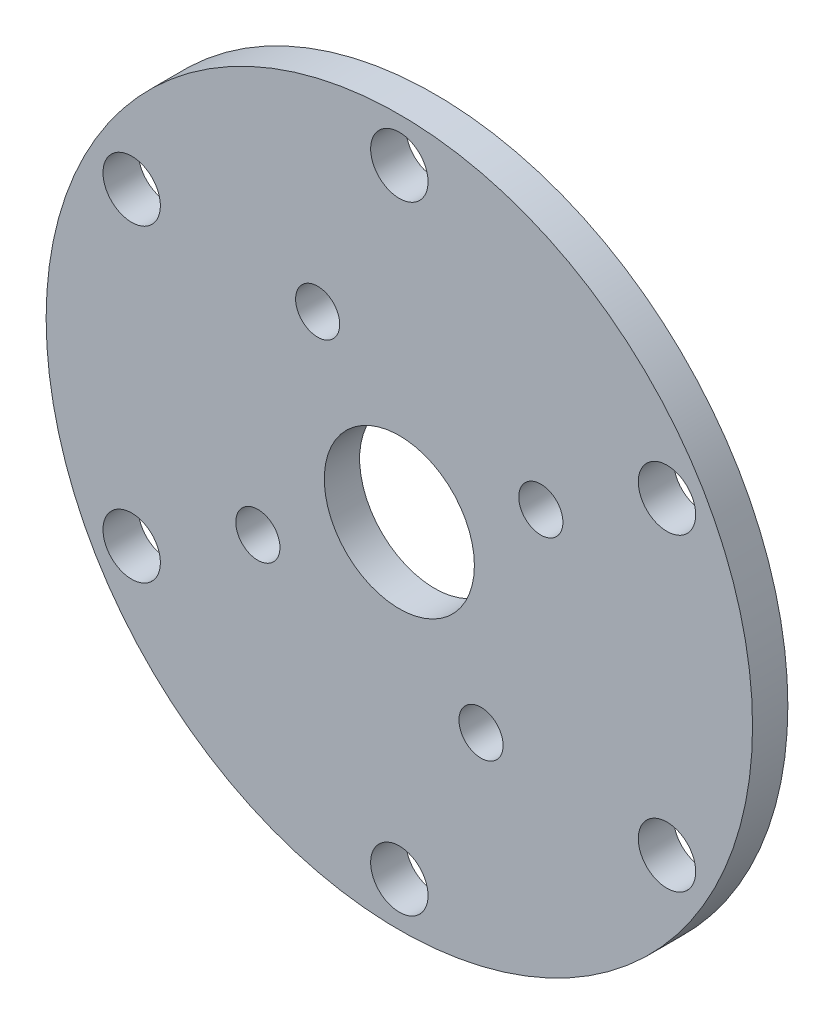
ISO-10303-21;
HEADER;
FILE_DESCRIPTION(('STEP AP214'),'2;1');
FILE_NAME('part.step','',(''),(''),'','','');
FILE_SCHEMA(('AUTOMOTIVE_DESIGN { 1 0 10303 214 1 1 1 1 }'));
ENDSEC;
DATA;
#1=APPLICATION_CONTEXT('core data for automotive mechanical design processes');
#2=APPLICATION_PROTOCOL_DEFINITION('international standard','automotive_design',2000,#1);
#3=PRODUCT_CONTEXT('',#1,'mechanical');
#4=PRODUCT('Part','Part','',(#3));
#5=PRODUCT_RELATED_PRODUCT_CATEGORY('part','',(#4));
#6=PRODUCT_DEFINITION_FORMATION('','',#4);
#7=PRODUCT_DEFINITION_CONTEXT('part definition',#1,'design');
#8=PRODUCT_DEFINITION('design','',#6,#7);
#9=PRODUCT_DEFINITION_SHAPE('','',#8);
#10=(LENGTH_UNIT() NAMED_UNIT(*) SI_UNIT(.MILLI.,.METRE.));
#11=(NAMED_UNIT(*) PLANE_ANGLE_UNIT() SI_UNIT($,.RADIAN.));
#12=(NAMED_UNIT(*) SI_UNIT($,.STERADIAN.) SOLID_ANGLE_UNIT());
#13=UNCERTAINTY_MEASURE_WITH_UNIT(LENGTH_MEASURE(1.E-05),#10,'distance_accuracy_value','');
#14=(GEOMETRIC_REPRESENTATION_CONTEXT(3) GLOBAL_UNCERTAINTY_ASSIGNED_CONTEXT((#13)) GLOBAL_UNIT_ASSIGNED_CONTEXT((#10,
#11,#12)) REPRESENTATION_CONTEXT('',''));
#15=CARTESIAN_POINT('',(0.,0.,0.));
#16=DIRECTION('',(0.,0.,1.));
#17=DIRECTION('',(1.,0.,0.));
#18=AXIS2_PLACEMENT_3D('',#15,#16,#17);
#19=CARTESIAN_POINT('',(30.3108891324554,17.5000000000017,4.));
#20=DIRECTION('',(0.,0.,-1.));
#21=DIRECTION('',(-1.,0.,0.));
#22=AXIS2_PLACEMENT_3D('',#19,#20,#21);
#23=CYLINDRICAL_SURFACE('',#22,3.25000000000125);
#24=CARTESIAN_POINT('',(30.3108891324554,17.5000000000017,4.));
#25=DIRECTION('',(0.,0.,1.));
#26=DIRECTION('',(1.,0.,0.));
#27=AXIS2_PLACEMENT_3D('',#24,#25,#26);
#28=CIRCLE('',#27,3.25000000000125);
#29=CARTESIAN_POINT('',(33.5608891324566,17.5000000000017,4.));
#30=VERTEX_POINT('',#29);
#31=EDGE_CURVE('E43',#30,#30,#28,.T.);
#32=ORIENTED_EDGE('',*,*,#31,.T.);
#33=EDGE_LOOP('',(#32));
#34=FACE_BOUND('',#33,.T.);
#35=CARTESIAN_POINT('',(30.3108891324554,17.5000000000017,0.));
#36=DIRECTION('',(0.,0.,1.));
#37=DIRECTION('',(1.,0.,0.));
#38=AXIS2_PLACEMENT_3D('',#35,#36,#37);
#39=CIRCLE('',#38,3.25000000000125);
#40=CARTESIAN_POINT('',(33.5608891324566,17.5000000000017,0.));
#41=VERTEX_POINT('',#40);
#42=EDGE_CURVE('E81',#41,#41,#39,.T.);
#43=ORIENTED_EDGE('',*,*,#42,.F.);
#44=EDGE_LOOP('',(#43));
#45=FACE_BOUND('',#44,.T.);
#46=ADVANCED_FACE('F35',(#34,#45),#23,.F.);
#47=CARTESIAN_POINT('',(30.3108891324568,-17.4999999999974,4.));
#48=DIRECTION('',(0.,0.,-1.));
#49=DIRECTION('',(-1.,0.,0.));
#50=AXIS2_PLACEMENT_3D('',#47,#48,#49);
#51=CYLINDRICAL_SURFACE('',#50,3.25000000000301);
#52=CARTESIAN_POINT('',(30.3108891324568,-17.4999999999974,4.));
#53=DIRECTION('',(0.,0.,1.));
#54=DIRECTION('',(1.,0.,0.));
#55=AXIS2_PLACEMENT_3D('',#52,#53,#54);
#56=CIRCLE('',#55,3.25000000000301);
#57=CARTESIAN_POINT('',(33.5608891324598,-17.4999999999974,4.));
#58=VERTEX_POINT('',#57);
#59=EDGE_CURVE('E48',#58,#58,#56,.T.);
#60=ORIENTED_EDGE('',*,*,#59,.T.);
#61=EDGE_LOOP('',(#60));
#62=FACE_BOUND('',#61,.T.);
#63=CARTESIAN_POINT('',(30.3108891324568,-17.4999999999974,0.));
#64=DIRECTION('',(0.,0.,1.));
#65=DIRECTION('',(1.,0.,0.));
#66=AXIS2_PLACEMENT_3D('',#63,#64,#65);
#67=CIRCLE('',#66,3.25000000000301);
#68=CARTESIAN_POINT('',(33.5608891324598,-17.4999999999974,0.));
#69=VERTEX_POINT('',#68);
#70=EDGE_CURVE('E79',#69,#69,#67,.T.);
#71=ORIENTED_EDGE('',*,*,#70,.F.);
#72=EDGE_LOOP('',(#71));
#73=FACE_BOUND('',#72,.T.);
#74=ADVANCED_FACE('F120',(#62,#73),#51,.F.);
#75=CARTESIAN_POINT('',(2.95747950929986E-12,-34.9999999999983,4.));
#76=DIRECTION('',(0.,0.,-1.));
#77=DIRECTION('',(-1.,0.,0.));
#78=AXIS2_PLACEMENT_3D('',#75,#76,#77);
#79=CYLINDRICAL_SURFACE('',#78,3.25000000000357);
#80=CARTESIAN_POINT('',(2.95747950929986E-12,-34.9999999999983,4.));
#81=DIRECTION('',(0.,0.,1.));
#82=DIRECTION('',(1.,0.,0.));
#83=AXIS2_PLACEMENT_3D('',#80,#81,#82);
#84=CIRCLE('',#83,3.25000000000357);
#85=CARTESIAN_POINT('',(3.25000000000653,-34.9999999999983,4.));
#86=VERTEX_POINT('',#85);
#87=EDGE_CURVE('E115',#86,#86,#84,.T.);
#88=ORIENTED_EDGE('',*,*,#87,.T.);
#89=EDGE_LOOP('',(#88));
#90=FACE_BOUND('',#89,.T.);
#91=CARTESIAN_POINT('',(2.95747950929986E-12,-34.9999999999983,0.));
#92=DIRECTION('',(0.,0.,1.));
#93=DIRECTION('',(1.,0.,0.));
#94=AXIS2_PLACEMENT_3D('',#91,#92,#93);
#95=CIRCLE('',#94,3.25000000000357);
#96=CARTESIAN_POINT('',(3.25000000000653,-34.9999999999983,0.));
#97=VERTEX_POINT('',#96);
#98=EDGE_CURVE('E76',#97,#97,#95,.T.);
#99=ORIENTED_EDGE('',*,*,#98,.F.);
#100=EDGE_LOOP('',(#99));
#101=FACE_BOUND('',#100,.T.);
#102=ADVANCED_FACE('F138',(#90,#101),#79,.F.);
#103=CARTESIAN_POINT('',(-30.3108891324524,-17.5,4.));
#104=DIRECTION('',(0.,0.,-1.));
#105=DIRECTION('',(-1.,0.,0.));
#106=AXIS2_PLACEMENT_3D('',#103,#104,#105);
#107=CYLINDRICAL_SURFACE('',#106,3.25000000000247);
#108=CARTESIAN_POINT('',(-30.3108891324524,-17.5,4.));
#109=DIRECTION('',(0.,0.,1.));
#110=DIRECTION('',(1.,0.,0.));
#111=AXIS2_PLACEMENT_3D('',#108,#109,#110);
#112=CIRCLE('',#111,3.25000000000247);
#113=CARTESIAN_POINT('',(-27.0608891324499,-17.5,4.));
#114=VERTEX_POINT('',#113);
#115=EDGE_CURVE('E112',#114,#114,#112,.T.);
#116=ORIENTED_EDGE('',*,*,#115,.T.);
#117=EDGE_LOOP('',(#116));
#118=FACE_BOUND('',#117,.T.);
#119=CARTESIAN_POINT('',(-30.3108891324524,-17.5,0.));
#120=DIRECTION('',(0.,0.,1.));
#121=DIRECTION('',(1.,0.,0.));
#122=AXIS2_PLACEMENT_3D('',#119,#120,#121);
#123=CIRCLE('',#122,3.25000000000247);
#124=CARTESIAN_POINT('',(-27.0608891324499,-17.5,0.));
#125=VERTEX_POINT('',#124);
#126=EDGE_CURVE('E73',#125,#125,#123,.T.);
#127=ORIENTED_EDGE('',*,*,#126,.F.);
#128=EDGE_LOOP('',(#127));
#129=FACE_BOUND('',#128,.T.);
#130=ADVANCED_FACE('F145',(#118,#129),#107,.F.);
#131=CARTESIAN_POINT('',(0.,35.,4.));
#132=DIRECTION('',(0.,0.,-1.));
#133=DIRECTION('',(-1.,0.,0.));
#134=AXIS2_PLACEMENT_3D('',#131,#132,#133);
#135=CYLINDRICAL_SURFACE('',#134,3.25);
#136=CARTESIAN_POINT('',(0.,35.,4.));
#137=DIRECTION('',(0.,0.,1.));
#138=DIRECTION('',(1.,0.,0.));
#139=AXIS2_PLACEMENT_3D('',#136,#137,#138);
#140=CIRCLE('',#139,3.25);
#141=CARTESIAN_POINT('',(3.25,35.,4.));
#142=VERTEX_POINT('',#141);
#143=EDGE_CURVE('E109',#142,#142,#140,.T.);
#144=ORIENTED_EDGE('',*,*,#143,.T.);
#145=EDGE_LOOP('',(#144));
#146=FACE_BOUND('',#145,.T.);
#147=CARTESIAN_POINT('',(0.,35.,0.));
#148=DIRECTION('',(0.,0.,1.));
#149=DIRECTION('',(1.,0.,0.));
#150=AXIS2_PLACEMENT_3D('',#147,#148,#149);
#151=CIRCLE('',#150,3.25);
#152=CARTESIAN_POINT('',(3.25,35.,0.));
#153=VERTEX_POINT('',#152);
#154=EDGE_CURVE('E70',#153,#153,#151,.T.);
#155=ORIENTED_EDGE('',*,*,#154,.F.);
#156=EDGE_LOOP('',(#155));
#157=FACE_BOUND('',#156,.T.);
#158=ADVANCED_FACE('F149',(#146,#157),#135,.F.);
#159=CARTESIAN_POINT('',(9.25000000000056,-16.0214699700118,4.));
#160=DIRECTION('',(0.,0.,-1.));
#161=DIRECTION('',(-1.,0.,0.));
#162=AXIS2_PLACEMENT_3D('',#159,#160,#161);
#163=CYLINDRICAL_SURFACE('',#162,2.5);
#164=CARTESIAN_POINT('',(9.25000000000056,-16.0214699700118,4.));
#165=DIRECTION('',(0.,0.,1.));
#166=DIRECTION('',(1.,0.,0.));
#167=AXIS2_PLACEMENT_3D('',#164,#165,#166);
#168=CIRCLE('',#167,2.5);
#169=CARTESIAN_POINT('',(11.7500000000006,-16.0214699700118,4.));
#170=VERTEX_POINT('',#169);
#171=EDGE_CURVE('E106',#170,#170,#168,.T.);
#172=ORIENTED_EDGE('',*,*,#171,.T.);
#173=EDGE_LOOP('',(#172));
#174=FACE_BOUND('',#173,.T.);
#175=CARTESIAN_POINT('',(9.25000000000056,-16.0214699700118,0.));
#176=DIRECTION('',(0.,0.,1.));
#177=DIRECTION('',(1.,0.,0.));
#178=AXIS2_PLACEMENT_3D('',#175,#176,#177);
#179=CIRCLE('',#178,2.5);
#180=CARTESIAN_POINT('',(11.7500000000006,-16.0214699700118,0.));
#181=VERTEX_POINT('',#180);
#182=EDGE_CURVE('E67',#181,#181,#179,.T.);
#183=ORIENTED_EDGE('',*,*,#182,.F.);
#184=EDGE_LOOP('',(#183));
#185=FACE_BOUND('',#184,.T.);
#186=ADVANCED_FACE('F153',(#174,#185),#163,.F.);
#187=CARTESIAN_POINT('',(-30.3108891324539,17.4999999999991,4.));
#188=DIRECTION('',(0.,0.,-1.));
#189=DIRECTION('',(-1.,0.,0.));
#190=AXIS2_PLACEMENT_3D('',#187,#188,#189);
#191=CYLINDRICAL_SURFACE('',#190,3.25000000000089);
#192=CARTESIAN_POINT('',(-30.3108891324539,17.4999999999991,4.));
#193=DIRECTION('',(0.,0.,1.));
#194=DIRECTION('',(1.,0.,0.));
#195=AXIS2_PLACEMENT_3D('',#192,#193,#194);
#196=CIRCLE('',#195,3.25000000000089);
#197=CARTESIAN_POINT('',(-27.060889132453,17.4999999999991,4.));
#198=VERTEX_POINT('',#197);
#199=EDGE_CURVE('E103',#198,#198,#196,.T.);
#200=ORIENTED_EDGE('',*,*,#199,.T.);
#201=EDGE_LOOP('',(#200));
#202=FACE_BOUND('',#201,.T.);
#203=CARTESIAN_POINT('',(-30.3108891324539,17.4999999999991,0.));
#204=DIRECTION('',(0.,0.,1.));
#205=DIRECTION('',(1.,0.,0.));
#206=AXIS2_PLACEMENT_3D('',#203,#204,#205);
#207=CIRCLE('',#206,3.25000000000089);
#208=CARTESIAN_POINT('',(-27.060889132453,17.4999999999991,0.));
#209=VERTEX_POINT('',#208);
#210=EDGE_CURVE('E64',#209,#209,#207,.T.);
#211=ORIENTED_EDGE('',*,*,#210,.F.);
#212=EDGE_LOOP('',(#211));
#213=FACE_BOUND('',#212,.T.);
#214=ADVANCED_FACE('F157',(#202,#213),#191,.F.);
#215=CARTESIAN_POINT('',(16.0214699700123,9.25000000000043,4.));
#216=DIRECTION('',(0.,0.,-1.));
#217=DIRECTION('',(-1.,0.,0.));
#218=AXIS2_PLACEMENT_3D('',#215,#216,#217);
#219=CYLINDRICAL_SURFACE('',#218,2.5);
#220=CARTESIAN_POINT('',(16.0214699700123,9.25000000000043,4.));
#221=DIRECTION('',(0.,0.,1.));
#222=DIRECTION('',(1.,0.,0.));
#223=AXIS2_PLACEMENT_3D('',#220,#221,#222);
#224=CIRCLE('',#223,2.5);
#225=CARTESIAN_POINT('',(18.5214699700123,9.25000000000043,4.));
#226=VERTEX_POINT('',#225);
#227=EDGE_CURVE('E100',#226,#226,#224,.T.);
#228=ORIENTED_EDGE('',*,*,#227,.T.);
#229=EDGE_LOOP('',(#228));
#230=FACE_BOUND('',#229,.T.);
#231=CARTESIAN_POINT('',(16.0214699700123,9.25000000000043,0.));
#232=DIRECTION('',(0.,0.,1.));
#233=DIRECTION('',(1.,0.,0.));
#234=AXIS2_PLACEMENT_3D('',#231,#232,#233);
#235=CIRCLE('',#234,2.5);
#236=CARTESIAN_POINT('',(18.5214699700123,9.25000000000043,0.));
#237=VERTEX_POINT('',#236);
#238=EDGE_CURVE('E61',#237,#237,#235,.T.);
#239=ORIENTED_EDGE('',*,*,#238,.F.);
#240=EDGE_LOOP('',(#239));
#241=FACE_BOUND('',#240,.T.);
#242=ADVANCED_FACE('F161',(#230,#241),#219,.F.);
#243=CARTESIAN_POINT('',(-16.0214699700117,-9.25000000000005,4.));
#244=DIRECTION('',(0.,0.,-1.));
#245=DIRECTION('',(-1.,0.,0.));
#246=AXIS2_PLACEMENT_3D('',#243,#244,#245);
#247=CYLINDRICAL_SURFACE('',#246,2.5);
#248=CARTESIAN_POINT('',(-16.0214699700117,-9.25000000000005,4.));
#249=DIRECTION('',(0.,0.,1.));
#250=DIRECTION('',(1.,0.,0.));
#251=AXIS2_PLACEMENT_3D('',#248,#249,#250);
#252=CIRCLE('',#251,2.5);
#253=CARTESIAN_POINT('',(-13.5214699700117,-9.25000000000005,4.));
#254=VERTEX_POINT('',#253);
#255=EDGE_CURVE('E95',#254,#254,#252,.T.);
#256=ORIENTED_EDGE('',*,*,#255,.T.);
#257=EDGE_LOOP('',(#256));
#258=FACE_BOUND('',#257,.T.);
#259=CARTESIAN_POINT('',(-16.0214699700117,-9.25000000000005,0.));
#260=DIRECTION('',(0.,0.,1.));
#261=DIRECTION('',(1.,0.,0.));
#262=AXIS2_PLACEMENT_3D('',#259,#260,#261);
#263=CIRCLE('',#262,2.5);
#264=CARTESIAN_POINT('',(-13.5214699700117,-9.25000000000005,0.));
#265=VERTEX_POINT('',#264);
#266=EDGE_CURVE('E58',#265,#265,#263,.T.);
#267=ORIENTED_EDGE('',*,*,#266,.F.);
#268=EDGE_LOOP('',(#267));
#269=FACE_BOUND('',#268,.T.);
#270=ADVANCED_FACE('F165',(#258,#269),#247,.F.);
#271=CARTESIAN_POINT('',(0.,0.,4.));
#272=DIRECTION('',(0.,0.,-1.));
#273=DIRECTION('',(-1.,0.,0.));
#274=AXIS2_PLACEMENT_3D('',#271,#272,#273);
#275=CYLINDRICAL_SURFACE('',#274,8.5);
#276=CARTESIAN_POINT('',(0.,0.,4.));
#277=DIRECTION('',(0.,0.,1.));
#278=DIRECTION('',(1.,0.,0.));
#279=AXIS2_PLACEMENT_3D('',#276,#277,#278);
#280=CIRCLE('',#279,8.5);
#281=CARTESIAN_POINT('',(8.5,0.,4.));
#282=VERTEX_POINT('',#281);
#283=EDGE_CURVE('E90',#282,#282,#280,.T.);
#284=ORIENTED_EDGE('',*,*,#283,.T.);
#285=EDGE_LOOP('',(#284));
#286=FACE_BOUND('',#285,.T.);
#287=CARTESIAN_POINT('',(0.,0.,0.));
#288=DIRECTION('',(0.,0.,1.));
#289=DIRECTION('',(1.,0.,0.));
#290=AXIS2_PLACEMENT_3D('',#287,#288,#289);
#291=CIRCLE('',#290,8.5);
#292=CARTESIAN_POINT('',(8.5,0.,0.));
#293=VERTEX_POINT('',#292);
#294=EDGE_CURVE('E55',#293,#293,#291,.T.);
#295=ORIENTED_EDGE('',*,*,#294,.F.);
#296=EDGE_LOOP('',(#295));
#297=FACE_BOUND('',#296,.T.);
#298=ADVANCED_FACE('F168',(#286,#297),#275,.F.);
#299=CARTESIAN_POINT('',(-9.24999999999991,16.0214699700122,4.));
#300=DIRECTION('',(0.,0.,-1.));
#301=DIRECTION('',(-1.,0.,0.));
#302=AXIS2_PLACEMENT_3D('',#299,#300,#301);
#303=CYLINDRICAL_SURFACE('',#302,2.5);
#304=CARTESIAN_POINT('',(-9.24999999999991,16.0214699700122,4.));
#305=DIRECTION('',(0.,0.,1.));
#306=DIRECTION('',(1.,0.,0.));
#307=AXIS2_PLACEMENT_3D('',#304,#305,#306);
#308=CIRCLE('',#307,2.5);
#309=CARTESIAN_POINT('',(-6.74999999999991,16.0214699700122,4.));
#310=VERTEX_POINT('',#309);
#311=EDGE_CURVE('E86',#310,#310,#308,.T.);
#312=ORIENTED_EDGE('',*,*,#311,.T.);
#313=EDGE_LOOP('',(#312));
#314=FACE_BOUND('',#313,.T.);
#315=CARTESIAN_POINT('',(-9.24999999999991,16.0214699700122,0.));
#316=DIRECTION('',(0.,0.,1.));
#317=DIRECTION('',(1.,0.,0.));
#318=AXIS2_PLACEMENT_3D('',#315,#316,#317);
#319=CIRCLE('',#318,2.5);
#320=CARTESIAN_POINT('',(-6.74999999999991,16.0214699700122,0.));
#321=VERTEX_POINT('',#320);
#322=EDGE_CURVE('E52',#321,#321,#319,.T.);
#323=ORIENTED_EDGE('',*,*,#322,.F.);
#324=EDGE_LOOP('',(#323));
#325=FACE_BOUND('',#324,.T.);
#326=ADVANCED_FACE('F37',(#314,#325),#303,.F.);
#327=CARTESIAN_POINT('',(0.,0.,4.));
#328=DIRECTION('',(0.,0.,-1.));
#329=DIRECTION('',(-1.,0.,0.));
#330=AXIS2_PLACEMENT_3D('',#327,#328,#329);
#331=CYLINDRICAL_SURFACE('',#330,40.);
#332=CARTESIAN_POINT('',(0.,0.,4.));
#333=DIRECTION('',(0.,0.,1.));
#334=DIRECTION('',(1.,0.,0.));
#335=AXIS2_PLACEMENT_3D('',#332,#333,#334);
#336=CIRCLE('',#335,40.);
#337=CARTESIAN_POINT('',(40.,0.,4.));
#338=VERTEX_POINT('',#337);
#339=EDGE_CURVE('E10',#338,#338,#336,.T.);
#340=ORIENTED_EDGE('',*,*,#339,.F.);
#341=EDGE_LOOP('',(#340));
#342=FACE_BOUND('',#341,.T.);
#343=CARTESIAN_POINT('',(0.,0.,0.));
#344=DIRECTION('',(0.,0.,1.));
#345=DIRECTION('',(1.,0.,0.));
#346=AXIS2_PLACEMENT_3D('',#343,#344,#345);
#347=CIRCLE('',#346,40.);
#348=CARTESIAN_POINT('',(40.,0.,0.));
#349=VERTEX_POINT('',#348);
#350=EDGE_CURVE('E39',#349,#349,#347,.T.);
#351=ORIENTED_EDGE('',*,*,#350,.T.);
#352=EDGE_LOOP('',(#351));
#353=FACE_BOUND('',#352,.T.);
#354=ADVANCED_FACE('F127',(#342,#353),#331,.T.);
#355=CARTESIAN_POINT('',(0.,0.,4.));
#356=DIRECTION('',(0.,0.,1.));
#357=DIRECTION('',(1.,0.,0.));
#358=AXIS2_PLACEMENT_3D('',#355,#356,#357);
#359=PLANE('',#358);
#360=ORIENTED_EDGE('',*,*,#311,.F.);
#361=EDGE_LOOP('',(#360));
#362=FACE_BOUND('',#361,.T.);
#363=ORIENTED_EDGE('',*,*,#283,.F.);
#364=EDGE_LOOP('',(#363));
#365=FACE_BOUND('',#364,.T.);
#366=ORIENTED_EDGE('',*,*,#255,.F.);
#367=EDGE_LOOP('',(#366));
#368=FACE_BOUND('',#367,.T.);
#369=ORIENTED_EDGE('',*,*,#227,.F.);
#370=EDGE_LOOP('',(#369));
#371=FACE_BOUND('',#370,.T.);
#372=ORIENTED_EDGE('',*,*,#199,.F.);
#373=EDGE_LOOP('',(#372));
#374=FACE_BOUND('',#373,.T.);
#375=ORIENTED_EDGE('',*,*,#171,.F.);
#376=EDGE_LOOP('',(#375));
#377=FACE_BOUND('',#376,.T.);
#378=ORIENTED_EDGE('',*,*,#143,.F.);
#379=EDGE_LOOP('',(#378));
#380=FACE_BOUND('',#379,.T.);
#381=ORIENTED_EDGE('',*,*,#115,.F.);
#382=EDGE_LOOP('',(#381));
#383=FACE_BOUND('',#382,.T.);
#384=ORIENTED_EDGE('',*,*,#87,.F.);
#385=EDGE_LOOP('',(#384));
#386=FACE_BOUND('',#385,.T.);
#387=ORIENTED_EDGE('',*,*,#59,.F.);
#388=EDGE_LOOP('',(#387));
#389=FACE_BOUND('',#388,.T.);
#390=ORIENTED_EDGE('',*,*,#31,.F.);
#391=EDGE_LOOP('',(#390));
#392=FACE_BOUND('',#391,.T.);
#393=ORIENTED_EDGE('',*,*,#339,.T.);
#394=EDGE_LOOP('',(#393));
#395=FACE_BOUND('',#394,.T.);
#396=ADVANCED_FACE('F123',(#362,#365,#368,#371,#374,#377,#380,#383,#386,#389,#392,#395),#359,.T.);
#397=CARTESIAN_POINT('',(0.,0.,0.));
#398=DIRECTION('',(0.,0.,1.));
#399=DIRECTION('',(1.,0.,0.));
#400=AXIS2_PLACEMENT_3D('',#397,#398,#399);
#401=PLANE('',#400);
#402=ORIENTED_EDGE('',*,*,#322,.T.);
#403=EDGE_LOOP('',(#402));
#404=FACE_BOUND('',#403,.T.);
#405=ORIENTED_EDGE('',*,*,#294,.T.);
#406=EDGE_LOOP('',(#405));
#407=FACE_BOUND('',#406,.T.);
#408=ORIENTED_EDGE('',*,*,#266,.T.);
#409=EDGE_LOOP('',(#408));
#410=FACE_BOUND('',#409,.T.);
#411=ORIENTED_EDGE('',*,*,#238,.T.);
#412=EDGE_LOOP('',(#411));
#413=FACE_BOUND('',#412,.T.);
#414=ORIENTED_EDGE('',*,*,#210,.T.);
#415=EDGE_LOOP('',(#414));
#416=FACE_BOUND('',#415,.T.);
#417=ORIENTED_EDGE('',*,*,#182,.T.);
#418=EDGE_LOOP('',(#417));
#419=FACE_BOUND('',#418,.T.);
#420=ORIENTED_EDGE('',*,*,#154,.T.);
#421=EDGE_LOOP('',(#420));
#422=FACE_BOUND('',#421,.T.);
#423=ORIENTED_EDGE('',*,*,#126,.T.);
#424=EDGE_LOOP('',(#423));
#425=FACE_BOUND('',#424,.T.);
#426=ORIENTED_EDGE('',*,*,#98,.T.);
#427=EDGE_LOOP('',(#426));
#428=FACE_BOUND('',#427,.T.);
#429=ORIENTED_EDGE('',*,*,#70,.T.);
#430=EDGE_LOOP('',(#429));
#431=FACE_BOUND('',#430,.T.);
#432=ORIENTED_EDGE('',*,*,#42,.T.);
#433=EDGE_LOOP('',(#432));
#434=FACE_BOUND('',#433,.T.);
#435=ORIENTED_EDGE('',*,*,#350,.F.);
#436=EDGE_LOOP('',(#435));
#437=FACE_BOUND('',#436,.T.);
#438=ADVANCED_FACE('F126',(#404,#407,#410,#413,#416,#419,#422,#425,#428,#431,#434,#437),#401,.F.);
#439=CLOSED_SHELL('',(#46,#74,#102,#130,#158,#186,#214,#242,#270,#298,#326,#354,#396,#438));
#440=MANIFOLD_SOLID_BREP('B2',#439);
#441=ADVANCED_BREP_SHAPE_REPRESENTATION('',(#18,#440),#14);
#442=SHAPE_DEFINITION_REPRESENTATION(#9,#441);
ENDSEC;
END-ISO-10303-21;
